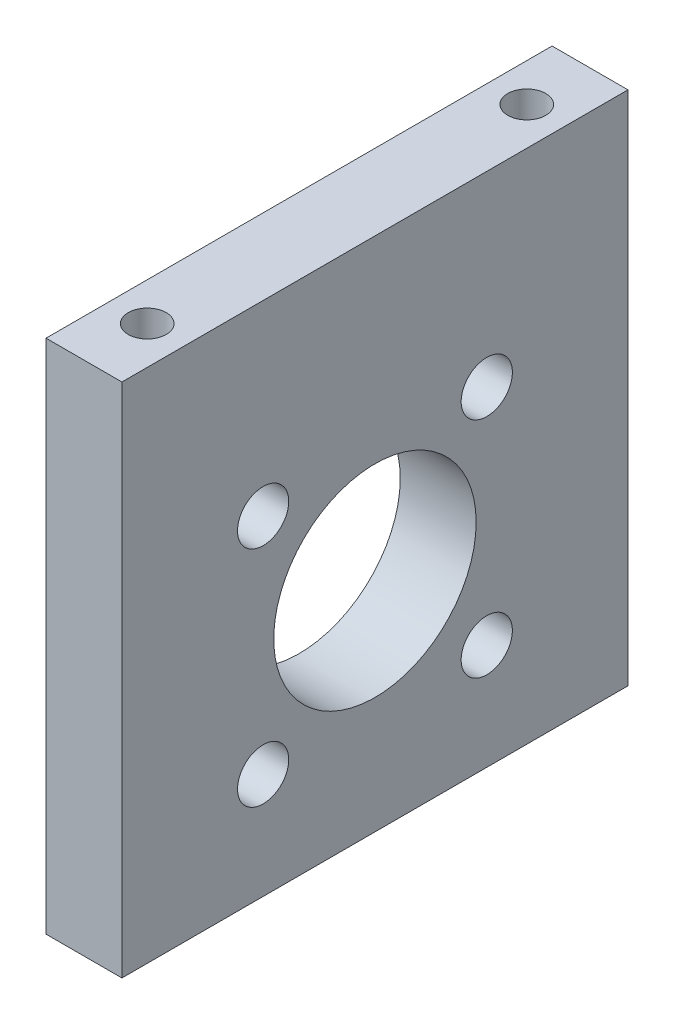
ISO-10303-21;
HEADER;
FILE_DESCRIPTION(('STEP AP214'),'2;1');
FILE_NAME('part.step','',(''),(''),'','','');
FILE_SCHEMA(('AUTOMOTIVE_DESIGN { 1 0 10303 214 1 1 1 1 }'));
ENDSEC;
DATA;
#1=APPLICATION_CONTEXT('core data for automotive mechanical design processes');
#2=APPLICATION_PROTOCOL_DEFINITION('international standard','automotive_design',2000,#1);
#3=PRODUCT_CONTEXT('',#1,'mechanical');
#4=PRODUCT('Part','Part','',(#3));
#5=PRODUCT_RELATED_PRODUCT_CATEGORY('part','',(#4));
#6=PRODUCT_DEFINITION_FORMATION('','',#4);
#7=PRODUCT_DEFINITION_CONTEXT('part definition',#1,'design');
#8=PRODUCT_DEFINITION('design','',#6,#7);
#9=PRODUCT_DEFINITION_SHAPE('','',#8);
#10=(LENGTH_UNIT() NAMED_UNIT(*) SI_UNIT(.MILLI.,.METRE.));
#11=(NAMED_UNIT(*) PLANE_ANGLE_UNIT() SI_UNIT($,.RADIAN.));
#12=(NAMED_UNIT(*) SI_UNIT($,.STERADIAN.) SOLID_ANGLE_UNIT());
#13=UNCERTAINTY_MEASURE_WITH_UNIT(LENGTH_MEASURE(1.E-05),#10,'distance_accuracy_value','');
#14=(GEOMETRIC_REPRESENTATION_CONTEXT(3) GLOBAL_UNCERTAINTY_ASSIGNED_CONTEXT((#13)) GLOBAL_UNIT_ASSIGNED_CONTEXT((#10,
#11,#12)) REPRESENTATION_CONTEXT('',''));
#15=CARTESIAN_POINT('',(0.,0.,0.));
#16=DIRECTION('',(0.,0.,1.));
#17=DIRECTION('',(1.,0.,0.));
#18=AXIS2_PLACEMENT_3D('',#15,#16,#17);
#19=CARTESIAN_POINT('',(6.,0.,0.));
#20=DIRECTION('',(1.,0.,0.));
#21=DIRECTION('',(0.,0.,-1.));
#22=AXIS2_PLACEMENT_3D('',#19,#20,#21);
#23=PLANE('',#22);
#24=CARTESIAN_POINT('',(6.,-8.83883476483182,-8.83883476483186));
#25=DIRECTION('',(1.,0.,0.));
#26=DIRECTION('',(0.,0.,-1.));
#27=AXIS2_PLACEMENT_3D('',#24,#25,#26);
#28=CIRCLE('',#27,2.025);
#29=CARTESIAN_POINT('',(6.,-8.83883476483182,-10.8638347648319));
#30=VERTEX_POINT('',#29);
#31=EDGE_CURVE('E134',#30,#30,#28,.T.);
#32=ORIENTED_EDGE('',*,*,#31,.F.);
#33=EDGE_LOOP('',(#32));
#34=FACE_BOUND('',#33,.T.);
#35=CARTESIAN_POINT('',(6.,8.83883476483183,8.83883476483186));
#36=DIRECTION('',(1.,0.,0.));
#37=DIRECTION('',(0.,0.,-1.));
#38=AXIS2_PLACEMENT_3D('',#35,#36,#37);
#39=CIRCLE('',#38,2.025);
#40=CARTESIAN_POINT('',(6.,8.83883476483183,6.81383476483186));
#41=VERTEX_POINT('',#40);
#42=EDGE_CURVE('E121',#41,#41,#39,.T.);
#43=ORIENTED_EDGE('',*,*,#42,.F.);
#44=EDGE_LOOP('',(#43));
#45=FACE_BOUND('',#44,.T.);
#46=DIRECTION('',(0.,-1.,0.));
#47=VECTOR('',#46,1.);
#48=CARTESIAN_POINT('',(6.,23.6,20.));
#49=LINE('',#48,#47);
#50=CARTESIAN_POINT('',(6.,23.6,20.));
#51=VERTEX_POINT('',#50);
#52=CARTESIAN_POINT('',(6.,-17.2,20.));
#53=VERTEX_POINT('',#52);
#54=EDGE_CURVE('E93',#51,#53,#49,.T.);
#55=ORIENTED_EDGE('',*,*,#54,.T.);
#56=DIRECTION('',(0.,0.,-1.));
#57=VECTOR('',#56,1.);
#58=CARTESIAN_POINT('',(6.,-17.2,20.));
#59=LINE('',#58,#57);
#60=CARTESIAN_POINT('',(6.,-17.2,-20.));
#61=VERTEX_POINT('',#60);
#62=EDGE_CURVE('E88',#53,#61,#59,.T.);
#63=ORIENTED_EDGE('',*,*,#62,.T.);
#64=DIRECTION('',(0.,1.,0.));
#65=VECTOR('',#64,1.);
#66=CARTESIAN_POINT('',(6.,23.6,-20.));
#67=LINE('',#66,#65);
#68=CARTESIAN_POINT('',(6.,23.6,-20.));
#69=VERTEX_POINT('',#68);
#70=EDGE_CURVE('E91',#61,#69,#67,.T.);
#71=ORIENTED_EDGE('',*,*,#70,.T.);
#72=DIRECTION('',(0.,0.,1.));
#73=VECTOR('',#72,1.);
#74=CARTESIAN_POINT('',(6.,23.6,20.));
#75=LINE('',#74,#73);
#76=EDGE_CURVE('E59',#69,#51,#75,.T.);
#77=ORIENTED_EDGE('',*,*,#76,.T.);
#78=EDGE_LOOP('',(#55,#63,#71,#77));
#79=FACE_BOUND('',#78,.T.);
#80=CARTESIAN_POINT('',(6.,0.,0.));
#81=DIRECTION('',(1.,0.,0.));
#82=DIRECTION('',(0.,0.,-1.));
#83=AXIS2_PLACEMENT_3D('',#80,#81,#82);
#84=CIRCLE('',#83,8.);
#85=CARTESIAN_POINT('',(6.,0.,-8.));
#86=VERTEX_POINT('',#85);
#87=EDGE_CURVE('E108',#86,#86,#84,.T.);
#88=ORIENTED_EDGE('',*,*,#87,.F.);
#89=EDGE_LOOP('',(#88));
#90=FACE_BOUND('',#89,.T.);
#91=CARTESIAN_POINT('',(6.,8.83883476483186,-8.83883476483183));
#92=DIRECTION('',(1.,0.,0.));
#93=DIRECTION('',(0.,0.,-1.));
#94=AXIS2_PLACEMENT_3D('',#91,#92,#93);
#95=CIRCLE('',#94,2.025);
#96=CARTESIAN_POINT('',(6.,8.83883476483186,-10.8638347648318));
#97=VERTEX_POINT('',#96);
#98=EDGE_CURVE('E129',#97,#97,#95,.T.);
#99=ORIENTED_EDGE('',*,*,#98,.F.);
#100=EDGE_LOOP('',(#99));
#101=FACE_BOUND('',#100,.T.);
#102=CARTESIAN_POINT('',(6.,-8.83883476483186,8.83883476483182));
#103=DIRECTION('',(1.,0.,0.));
#104=DIRECTION('',(0.,0.,-1.));
#105=AXIS2_PLACEMENT_3D('',#102,#103,#104);
#106=CIRCLE('',#105,2.025);
#107=CARTESIAN_POINT('',(6.,-8.83883476483186,6.81383476483182));
#108=VERTEX_POINT('',#107);
#109=EDGE_CURVE('E141',#108,#108,#106,.T.);
#110=ORIENTED_EDGE('',*,*,#109,.F.);
#111=EDGE_LOOP('',(#110));
#112=FACE_BOUND('',#111,.T.);
#113=ADVANCED_FACE('F41',(#34,#45,#79,#90,#101,#112),#23,.T.);
#114=CARTESIAN_POINT('',(0.,0.,0.));
#115=DIRECTION('',(1.,0.,0.));
#116=DIRECTION('',(0.,0.,-1.));
#117=AXIS2_PLACEMENT_3D('',#114,#115,#116);
#118=PLANE('',#117);
#119=DIRECTION('',(0.,-1.,0.));
#120=VECTOR('',#119,1.);
#121=CARTESIAN_POINT('',(0.,23.6,20.));
#122=LINE('',#121,#120);
#123=CARTESIAN_POINT('',(0.,23.6,20.));
#124=VERTEX_POINT('',#123);
#125=CARTESIAN_POINT('',(0.,-17.2,20.));
#126=VERTEX_POINT('',#125);
#127=EDGE_CURVE('E103',#124,#126,#122,.T.);
#128=ORIENTED_EDGE('',*,*,#127,.F.);
#129=DIRECTION('',(0.,0.,1.));
#130=VECTOR('',#129,1.);
#131=CARTESIAN_POINT('',(0.,23.6,20.));
#132=LINE('',#131,#130);
#133=CARTESIAN_POINT('',(0.,23.6,-20.));
#134=VERTEX_POINT('',#133);
#135=EDGE_CURVE('E83',#134,#124,#132,.T.);
#136=ORIENTED_EDGE('',*,*,#135,.F.);
#137=DIRECTION('',(0.,1.,0.));
#138=VECTOR('',#137,1.);
#139=CARTESIAN_POINT('',(0.,23.6,-20.));
#140=LINE('',#139,#138);
#141=CARTESIAN_POINT('',(0.,-17.2,-20.));
#142=VERTEX_POINT('',#141);
#143=EDGE_CURVE('E71',#142,#134,#140,.T.);
#144=ORIENTED_EDGE('',*,*,#143,.F.);
#145=DIRECTION('',(0.,0.,-1.));
#146=VECTOR('',#145,1.);
#147=CARTESIAN_POINT('',(0.,-17.2,20.));
#148=LINE('',#147,#146);
#149=EDGE_CURVE('E100',#126,#142,#148,.T.);
#150=ORIENTED_EDGE('',*,*,#149,.F.);
#151=EDGE_LOOP('',(#128,#136,#144,#150));
#152=FACE_BOUND('',#151,.T.);
#153=CARTESIAN_POINT('',(0.,0.,0.));
#154=DIRECTION('',(1.,0.,0.));
#155=DIRECTION('',(0.,0.,-1.));
#156=AXIS2_PLACEMENT_3D('',#153,#154,#155);
#157=CIRCLE('',#156,8.);
#158=CARTESIAN_POINT('',(0.,0.,-8.));
#159=VERTEX_POINT('',#158);
#160=EDGE_CURVE('E116',#159,#159,#157,.T.);
#161=ORIENTED_EDGE('',*,*,#160,.T.);
#162=EDGE_LOOP('',(#161));
#163=FACE_BOUND('',#162,.T.);
#164=CARTESIAN_POINT('',(0.,8.83883476483183,8.83883476483186));
#165=DIRECTION('',(1.,0.,0.));
#166=DIRECTION('',(0.,0.,-1.));
#167=AXIS2_PLACEMENT_3D('',#164,#165,#166);
#168=CIRCLE('',#167,2.025);
#169=CARTESIAN_POINT('',(0.,8.83883476483183,6.81383476483186));
#170=VERTEX_POINT('',#169);
#171=EDGE_CURVE('E128',#170,#170,#168,.T.);
#172=ORIENTED_EDGE('',*,*,#171,.T.);
#173=EDGE_LOOP('',(#172));
#174=FACE_BOUND('',#173,.T.);
#175=CARTESIAN_POINT('',(0.,8.83883476483186,-8.83883476483183));
#176=DIRECTION('',(1.,0.,0.));
#177=DIRECTION('',(0.,0.,-1.));
#178=AXIS2_PLACEMENT_3D('',#175,#176,#177);
#179=CIRCLE('',#178,2.025);
#180=CARTESIAN_POINT('',(0.,8.83883476483186,-10.8638347648318));
#181=VERTEX_POINT('',#180);
#182=EDGE_CURVE('E135',#181,#181,#179,.T.);
#183=ORIENTED_EDGE('',*,*,#182,.T.);
#184=EDGE_LOOP('',(#183));
#185=FACE_BOUND('',#184,.T.);
#186=CARTESIAN_POINT('',(0.,-8.83883476483182,-8.83883476483186));
#187=DIRECTION('',(1.,0.,0.));
#188=DIRECTION('',(0.,0.,-1.));
#189=AXIS2_PLACEMENT_3D('',#186,#187,#188);
#190=CIRCLE('',#189,2.025);
#191=CARTESIAN_POINT('',(0.,-8.83883476483182,-10.8638347648319));
#192=VERTEX_POINT('',#191);
#193=EDGE_CURVE('E138',#192,#192,#190,.T.);
#194=ORIENTED_EDGE('',*,*,#193,.T.);
#195=EDGE_LOOP('',(#194));
#196=FACE_BOUND('',#195,.T.);
#197=CARTESIAN_POINT('',(0.,-8.83883476483186,8.83883476483182));
#198=DIRECTION('',(1.,0.,0.));
#199=DIRECTION('',(0.,0.,-1.));
#200=AXIS2_PLACEMENT_3D('',#197,#198,#199);
#201=CIRCLE('',#200,2.025);
#202=CARTESIAN_POINT('',(0.,-8.83883476483186,6.81383476483182));
#203=VERTEX_POINT('',#202);
#204=EDGE_CURVE('E143',#203,#203,#201,.T.);
#205=ORIENTED_EDGE('',*,*,#204,.T.);
#206=EDGE_LOOP('',(#205));
#207=FACE_BOUND('',#206,.T.);
#208=ADVANCED_FACE('F117',(#152,#163,#174,#185,#196,#207),#118,.F.);
#209=CARTESIAN_POINT('',(6.,23.6,20.));
#210=DIRECTION('',(0.,0.,-1.));
#211=DIRECTION('',(0.,1.,0.));
#212=AXIS2_PLACEMENT_3D('',#209,#210,#211);
#213=PLANE('',#212);
#214=ORIENTED_EDGE('',*,*,#127,.T.);
#215=DIRECTION('',(-1.,0.,0.));
#216=VECTOR('',#215,1.);
#217=CARTESIAN_POINT('',(6.,-17.2,20.));
#218=LINE('',#217,#216);
#219=EDGE_CURVE('E11',#53,#126,#218,.T.);
#220=ORIENTED_EDGE('',*,*,#219,.F.);
#221=ORIENTED_EDGE('',*,*,#54,.F.);
#222=DIRECTION('',(-1.,0.,0.));
#223=VECTOR('',#222,1.);
#224=CARTESIAN_POINT('',(6.,23.6,20.));
#225=LINE('',#224,#223);
#226=EDGE_CURVE('E102',#51,#124,#225,.T.);
#227=ORIENTED_EDGE('',*,*,#226,.T.);
#228=EDGE_LOOP('',(#214,#220,#221,#227));
#229=FACE_BOUND('',#228,.T.);
#230=ADVANCED_FACE('F43',(#229),#213,.F.);
#231=CARTESIAN_POINT('',(6.,-17.2,20.));
#232=DIRECTION('',(0.,1.,0.));
#233=DIRECTION('',(0.,0.,1.));
#234=AXIS2_PLACEMENT_3D('',#231,#232,#233);
#235=PLANE('',#234);
#236=CARTESIAN_POINT('',(3.,-17.2,-15.));
#237=DIRECTION('',(0.,1.,0.));
#238=DIRECTION('',(0.,0.,1.));
#239=AXIS2_PLACEMENT_3D('',#236,#237,#238);
#240=CIRCLE('',#239,1.5);
#241=CARTESIAN_POINT('',(3.,-17.2,-13.5));
#242=VERTEX_POINT('',#241);
#243=EDGE_CURVE('E150',#242,#242,#240,.T.);
#244=ORIENTED_EDGE('',*,*,#243,.T.);
#245=EDGE_LOOP('',(#244));
#246=FACE_BOUND('',#245,.T.);
#247=CARTESIAN_POINT('',(3.,-17.2,15.));
#248=DIRECTION('',(0.,1.,0.));
#249=DIRECTION('',(0.,0.,-1.));
#250=AXIS2_PLACEMENT_3D('',#247,#248,#249);
#251=CIRCLE('',#250,1.5);
#252=CARTESIAN_POINT('',(3.,-17.2,16.5));
#253=VERTEX_POINT('',#252);
#254=EDGE_CURVE('E154',#253,#253,#251,.T.);
#255=ORIENTED_EDGE('',*,*,#254,.T.);
#256=EDGE_LOOP('',(#255));
#257=FACE_BOUND('',#256,.T.);
#258=ORIENTED_EDGE('',*,*,#149,.T.);
#259=DIRECTION('',(-1.,0.,0.));
#260=VECTOR('',#259,1.);
#261=CARTESIAN_POINT('',(6.,-17.2,-20.));
#262=LINE('',#261,#260);
#263=EDGE_CURVE('E49',#61,#142,#262,.T.);
#264=ORIENTED_EDGE('',*,*,#263,.F.);
#265=ORIENTED_EDGE('',*,*,#62,.F.);
#266=ORIENTED_EDGE('',*,*,#219,.T.);
#267=EDGE_LOOP('',(#258,#264,#265,#266));
#268=FACE_BOUND('',#267,.T.);
#269=ADVANCED_FACE('F96',(#246,#257,#268),#235,.F.);
#270=CARTESIAN_POINT('',(6.,23.6,-20.));
#271=DIRECTION('',(0.,0.,1.));
#272=DIRECTION('',(0.,-1.,0.));
#273=AXIS2_PLACEMENT_3D('',#270,#271,#272);
#274=PLANE('',#273);
#275=ORIENTED_EDGE('',*,*,#143,.T.);
#276=DIRECTION('',(-1.,0.,0.));
#277=VECTOR('',#276,1.);
#278=CARTESIAN_POINT('',(6.,23.6,-20.));
#279=LINE('',#278,#277);
#280=EDGE_CURVE('E97',#69,#134,#279,.T.);
#281=ORIENTED_EDGE('',*,*,#280,.F.);
#282=ORIENTED_EDGE('',*,*,#70,.F.);
#283=ORIENTED_EDGE('',*,*,#263,.T.);
#284=EDGE_LOOP('',(#275,#281,#282,#283));
#285=FACE_BOUND('',#284,.T.);
#286=ADVANCED_FACE('F98',(#285),#274,.F.);
#287=CARTESIAN_POINT('',(6.,23.6,20.));
#288=DIRECTION('',(0.,-1.,0.));
#289=DIRECTION('',(0.,0.,-1.));
#290=AXIS2_PLACEMENT_3D('',#287,#288,#289);
#291=PLANE('',#290);
#292=CARTESIAN_POINT('',(3.,23.6,-15.));
#293=DIRECTION('',(0.,1.,0.));
#294=DIRECTION('',(0.,0.,1.));
#295=AXIS2_PLACEMENT_3D('',#292,#293,#294);
#296=CIRCLE('',#295,1.5);
#297=CARTESIAN_POINT('',(3.,23.6,-13.5));
#298=VERTEX_POINT('',#297);
#299=EDGE_CURVE('E153',#298,#298,#296,.T.);
#300=ORIENTED_EDGE('',*,*,#299,.F.);
#301=EDGE_LOOP('',(#300));
#302=FACE_BOUND('',#301,.T.);
#303=CARTESIAN_POINT('',(3.,23.6,15.));
#304=DIRECTION('',(0.,1.,0.));
#305=DIRECTION('',(0.,0.,-1.));
#306=AXIS2_PLACEMENT_3D('',#303,#304,#305);
#307=CIRCLE('',#306,1.5);
#308=CARTESIAN_POINT('',(3.,23.6,16.5));
#309=VERTEX_POINT('',#308);
#310=EDGE_CURVE('E148',#309,#309,#307,.T.);
#311=ORIENTED_EDGE('',*,*,#310,.F.);
#312=EDGE_LOOP('',(#311));
#313=FACE_BOUND('',#312,.T.);
#314=ORIENTED_EDGE('',*,*,#135,.T.);
#315=ORIENTED_EDGE('',*,*,#226,.F.);
#316=ORIENTED_EDGE('',*,*,#76,.F.);
#317=ORIENTED_EDGE('',*,*,#280,.T.);
#318=EDGE_LOOP('',(#314,#315,#316,#317));
#319=FACE_BOUND('',#318,.T.);
#320=ADVANCED_FACE('F111',(#302,#313,#319),#291,.F.);
#321=CARTESIAN_POINT('',(6.,0.,0.));
#322=DIRECTION('',(-1.,0.,0.));
#323=DIRECTION('',(0.,0.,1.));
#324=AXIS2_PLACEMENT_3D('',#321,#322,#323);
#325=CYLINDRICAL_SURFACE('',#324,8.);
#326=ORIENTED_EDGE('',*,*,#87,.T.);
#327=EDGE_LOOP('',(#326));
#328=FACE_BOUND('',#327,.T.);
#329=ORIENTED_EDGE('',*,*,#160,.F.);
#330=EDGE_LOOP('',(#329));
#331=FACE_BOUND('',#330,.T.);
#332=ADVANCED_FACE('F168',(#328,#331),#325,.F.);
#333=CARTESIAN_POINT('',(6.,8.83883476483183,8.83883476483186));
#334=DIRECTION('',(-1.,0.,0.));
#335=DIRECTION('',(0.,0.,1.));
#336=AXIS2_PLACEMENT_3D('',#333,#334,#335);
#337=CYLINDRICAL_SURFACE('',#336,2.025);
#338=ORIENTED_EDGE('',*,*,#42,.T.);
#339=EDGE_LOOP('',(#338));
#340=FACE_BOUND('',#339,.T.);
#341=ORIENTED_EDGE('',*,*,#171,.F.);
#342=EDGE_LOOP('',(#341));
#343=FACE_BOUND('',#342,.T.);
#344=ADVANCED_FACE('F225',(#340,#343),#337,.F.);
#345=CARTESIAN_POINT('',(6.,8.83883476483186,-8.83883476483183));
#346=DIRECTION('',(-1.,0.,0.));
#347=DIRECTION('',(0.,0.,1.));
#348=AXIS2_PLACEMENT_3D('',#345,#346,#347);
#349=CYLINDRICAL_SURFACE('',#348,2.025);
#350=ORIENTED_EDGE('',*,*,#98,.T.);
#351=EDGE_LOOP('',(#350));
#352=FACE_BOUND('',#351,.T.);
#353=ORIENTED_EDGE('',*,*,#182,.F.);
#354=EDGE_LOOP('',(#353));
#355=FACE_BOUND('',#354,.T.);
#356=ADVANCED_FACE('F229',(#352,#355),#349,.F.);
#357=CARTESIAN_POINT('',(6.,-8.83883476483182,-8.83883476483186));
#358=DIRECTION('',(-1.,0.,0.));
#359=DIRECTION('',(0.,0.,1.));
#360=AXIS2_PLACEMENT_3D('',#357,#358,#359);
#361=CYLINDRICAL_SURFACE('',#360,2.025);
#362=ORIENTED_EDGE('',*,*,#31,.T.);
#363=EDGE_LOOP('',(#362));
#364=FACE_BOUND('',#363,.T.);
#365=ORIENTED_EDGE('',*,*,#193,.F.);
#366=EDGE_LOOP('',(#365));
#367=FACE_BOUND('',#366,.T.);
#368=ADVANCED_FACE('F181',(#364,#367),#361,.F.);
#369=CARTESIAN_POINT('',(6.,-8.83883476483186,8.83883476483182));
#370=DIRECTION('',(-1.,0.,0.));
#371=DIRECTION('',(0.,0.,1.));
#372=AXIS2_PLACEMENT_3D('',#369,#370,#371);
#373=CYLINDRICAL_SURFACE('',#372,2.025);
#374=ORIENTED_EDGE('',*,*,#109,.T.);
#375=EDGE_LOOP('',(#374));
#376=FACE_BOUND('',#375,.T.);
#377=ORIENTED_EDGE('',*,*,#204,.F.);
#378=EDGE_LOOP('',(#377));
#379=FACE_BOUND('',#378,.T.);
#380=ADVANCED_FACE('F175',(#376,#379),#373,.F.);
#381=CARTESIAN_POINT('',(3.,-17.2,15.));
#382=DIRECTION('',(0.,1.,0.));
#383=DIRECTION('',(0.,0.,1.));
#384=AXIS2_PLACEMENT_3D('',#381,#382,#383);
#385=CYLINDRICAL_SURFACE('',#384,1.5);
#386=CARTESIAN_POINT('',(3.,-17.2,16.5));
#387=CARTESIAN_POINT('',(3.,-16.775,16.5));
#388=CARTESIAN_POINT('',(3.,-16.35,16.5));
#389=CARTESIAN_POINT('',(3.,-15.5,16.5));
#390=CARTESIAN_POINT('',(3.,-15.075,16.5));
#391=CARTESIAN_POINT('',(3.,-14.225,16.5));
#392=CARTESIAN_POINT('',(3.,-13.8,16.5));
#393=CARTESIAN_POINT('',(3.,-12.95,16.5));
#394=CARTESIAN_POINT('',(3.,-12.525,16.5));
#395=CARTESIAN_POINT('',(3.,-11.675,16.5));
#396=CARTESIAN_POINT('',(3.,-11.25,16.5));
#397=CARTESIAN_POINT('',(3.,-10.4,16.5));
#398=CARTESIAN_POINT('',(3.,-9.975,16.5));
#399=CARTESIAN_POINT('',(3.,-9.125,16.5));
#400=CARTESIAN_POINT('',(3.,-8.7,16.5));
#401=CARTESIAN_POINT('',(3.,-7.85,16.5));
#402=CARTESIAN_POINT('',(3.,-7.425,16.5));
#403=CARTESIAN_POINT('',(3.,-6.575,16.5));
#404=CARTESIAN_POINT('',(3.,-6.15,16.5));
#405=CARTESIAN_POINT('',(3.,-5.3,16.5));
#406=CARTESIAN_POINT('',(3.,-4.875,16.5));
#407=CARTESIAN_POINT('',(3.,-4.025,16.5));
#408=CARTESIAN_POINT('',(3.,-3.6,16.5));
#409=CARTESIAN_POINT('',(3.,-2.75,16.5));
#410=CARTESIAN_POINT('',(3.,-2.325,16.5));
#411=CARTESIAN_POINT('',(3.,-1.475,16.5));
#412=CARTESIAN_POINT('',(3.,-1.05,16.5));
#413=CARTESIAN_POINT('',(3.,-0.200000000000003,16.5));
#414=CARTESIAN_POINT('',(3.,0.224999999999997,16.5));
#415=CARTESIAN_POINT('',(3.,1.075,16.5));
#416=CARTESIAN_POINT('',(3.,1.5,16.5));
#417=CARTESIAN_POINT('',(3.,2.35,16.5));
#418=CARTESIAN_POINT('',(3.,2.775,16.5));
#419=CARTESIAN_POINT('',(3.,3.625,16.5));
#420=CARTESIAN_POINT('',(3.,4.05,16.5));
#421=CARTESIAN_POINT('',(3.,4.9,16.5));
#422=CARTESIAN_POINT('',(3.,5.325,16.5));
#423=CARTESIAN_POINT('',(3.,6.175,16.5));
#424=CARTESIAN_POINT('',(3.,6.6,16.5));
#425=CARTESIAN_POINT('',(3.,7.45,16.5));
#426=CARTESIAN_POINT('',(3.,7.875,16.5));
#427=CARTESIAN_POINT('',(3.,8.725,16.5));
#428=CARTESIAN_POINT('',(3.,9.15,16.5));
#429=CARTESIAN_POINT('',(3.,10.,16.5));
#430=CARTESIAN_POINT('',(3.,10.425,16.5));
#431=CARTESIAN_POINT('',(3.,11.275,16.5));
#432=CARTESIAN_POINT('',(3.,11.7,16.5));
#433=CARTESIAN_POINT('',(3.,12.55,16.5));
#434=CARTESIAN_POINT('',(3.,12.975,16.5));
#435=CARTESIAN_POINT('',(3.,13.825,16.5));
#436=CARTESIAN_POINT('',(3.,14.25,16.5));
#437=CARTESIAN_POINT('',(3.,15.1,16.5));
#438=CARTESIAN_POINT('',(3.,15.525,16.5));
#439=CARTESIAN_POINT('',(3.,16.375,16.5));
#440=CARTESIAN_POINT('',(3.,16.8,16.5));
#441=CARTESIAN_POINT('',(3.,17.65,16.5));
#442=CARTESIAN_POINT('',(3.,18.075,16.5));
#443=CARTESIAN_POINT('',(3.,18.925,16.5));
#444=CARTESIAN_POINT('',(3.,19.35,16.5));
#445=CARTESIAN_POINT('',(3.,20.2,16.5));
#446=CARTESIAN_POINT('',(3.,20.625,16.5));
#447=CARTESIAN_POINT('',(3.,21.475,16.5));
#448=CARTESIAN_POINT('',(3.,21.9,16.5));
#449=CARTESIAN_POINT('',(3.,22.75,16.5));
#450=CARTESIAN_POINT('',(3.,23.175,16.5));
#451=CARTESIAN_POINT('',(3.,23.6,16.5));
#452=B_SPLINE_CURVE_WITH_KNOTS('',3,(#386,#387,#388,#389,#390,#391,#392,#393,#394,#395,#396,
#397,#398,#399,#400,#401,#402,#403,#404,#405,#406,#407,#408,#409,#410,#411,#412,#413,#414,#415,
#416,#417,#418,#419,#420,#421,#422,#423,#424,#425,#426,#427,#428,#429,#430,#431,#432,#433,#434,
#435,#436,#437,#438,#439,#440,#441,#442,#443,#444,#445,#446,#447,#448,#449,#450,#451),
.UNSPECIFIED.,.F.,.F.,(4,2,2,2,2,2,2,2,2,2,2,2,2,2,2,2,2,2,2,2,2,2,2,2,2,2,2,2,2,2,2,2,4),(0.,
1.275,2.55,3.825,5.1,6.375,7.65,8.925,10.2,11.475,12.75,14.025,15.3,16.575,17.85,19.125,20.4,
21.675,22.95,24.225,25.5,26.775,28.05,29.325,30.6,31.875,33.15,34.425,35.7,36.975,38.25,39.525,
40.8),.UNSPECIFIED.);
#453=EDGE_CURVE('BSEAM169',#253,#309,#452,.T.);
#454=ORIENTED_EDGE('',*,*,#254,.F.);
#455=ORIENTED_EDGE('',*,*,#310,.T.);
#456=ORIENTED_EDGE('',*,*,#453,.T.);
#457=ORIENTED_EDGE('',*,*,#453,.F.);
#458=EDGE_LOOP('',(#454,#456,#455,#457));
#459=FACE_BOUND('',#458,.T.);
#460=ADVANCED_FACE('F169',(#459),#385,.F.);
#461=CARTESIAN_POINT('',(3.,-17.2,-15.));
#462=DIRECTION('',(0.,1.,0.));
#463=DIRECTION('',(0.,0.,1.));
#464=AXIS2_PLACEMENT_3D('',#461,#462,#463);
#465=CYLINDRICAL_SURFACE('',#464,1.5);
#466=CARTESIAN_POINT('',(3.,-17.2,-13.5));
#467=CARTESIAN_POINT('',(3.,-16.775,-13.5));
#468=CARTESIAN_POINT('',(3.,-16.35,-13.5));
#469=CARTESIAN_POINT('',(3.,-15.5,-13.5));
#470=CARTESIAN_POINT('',(3.,-15.075,-13.5));
#471=CARTESIAN_POINT('',(3.,-14.225,-13.5));
#472=CARTESIAN_POINT('',(3.,-13.8,-13.5));
#473=CARTESIAN_POINT('',(3.,-12.95,-13.5));
#474=CARTESIAN_POINT('',(3.,-12.525,-13.5));
#475=CARTESIAN_POINT('',(3.,-11.675,-13.5));
#476=CARTESIAN_POINT('',(3.,-11.25,-13.5));
#477=CARTESIAN_POINT('',(3.,-10.4,-13.5));
#478=CARTESIAN_POINT('',(3.,-9.975,-13.5));
#479=CARTESIAN_POINT('',(3.,-9.125,-13.5));
#480=CARTESIAN_POINT('',(3.,-8.7,-13.5));
#481=CARTESIAN_POINT('',(3.,-7.85,-13.5));
#482=CARTESIAN_POINT('',(3.,-7.425,-13.5));
#483=CARTESIAN_POINT('',(3.,-6.575,-13.5));
#484=CARTESIAN_POINT('',(3.,-6.15,-13.5));
#485=CARTESIAN_POINT('',(3.,-5.3,-13.5));
#486=CARTESIAN_POINT('',(3.,-4.875,-13.5));
#487=CARTESIAN_POINT('',(3.,-4.025,-13.5));
#488=CARTESIAN_POINT('',(3.,-3.6,-13.5));
#489=CARTESIAN_POINT('',(3.,-2.75,-13.5));
#490=CARTESIAN_POINT('',(3.,-2.325,-13.5));
#491=CARTESIAN_POINT('',(3.,-1.475,-13.5));
#492=CARTESIAN_POINT('',(3.,-1.05,-13.5));
#493=CARTESIAN_POINT('',(3.,-0.200000000000003,-13.5));
#494=CARTESIAN_POINT('',(3.,0.224999999999997,-13.5));
#495=CARTESIAN_POINT('',(3.,1.075,-13.5));
#496=CARTESIAN_POINT('',(3.,1.5,-13.5));
#497=CARTESIAN_POINT('',(3.,2.35,-13.5));
#498=CARTESIAN_POINT('',(3.,2.775,-13.5));
#499=CARTESIAN_POINT('',(3.,3.625,-13.5));
#500=CARTESIAN_POINT('',(3.,4.05,-13.5));
#501=CARTESIAN_POINT('',(3.,4.9,-13.5));
#502=CARTESIAN_POINT('',(3.,5.325,-13.5));
#503=CARTESIAN_POINT('',(3.,6.175,-13.5));
#504=CARTESIAN_POINT('',(3.,6.6,-13.5));
#505=CARTESIAN_POINT('',(3.,7.45,-13.5));
#506=CARTESIAN_POINT('',(3.,7.875,-13.5));
#507=CARTESIAN_POINT('',(3.,8.725,-13.5));
#508=CARTESIAN_POINT('',(3.,9.15,-13.5));
#509=CARTESIAN_POINT('',(3.,10.,-13.5));
#510=CARTESIAN_POINT('',(3.,10.425,-13.5));
#511=CARTESIAN_POINT('',(3.,11.275,-13.5));
#512=CARTESIAN_POINT('',(3.,11.7,-13.5));
#513=CARTESIAN_POINT('',(3.,12.55,-13.5));
#514=CARTESIAN_POINT('',(3.,12.975,-13.5));
#515=CARTESIAN_POINT('',(3.,13.825,-13.5));
#516=CARTESIAN_POINT('',(3.,14.25,-13.5));
#517=CARTESIAN_POINT('',(3.,15.1,-13.5));
#518=CARTESIAN_POINT('',(3.,15.525,-13.5));
#519=CARTESIAN_POINT('',(3.,16.375,-13.5));
#520=CARTESIAN_POINT('',(3.,16.8,-13.5));
#521=CARTESIAN_POINT('',(3.,17.65,-13.5));
#522=CARTESIAN_POINT('',(3.,18.075,-13.5));
#523=CARTESIAN_POINT('',(3.,18.925,-13.5));
#524=CARTESIAN_POINT('',(3.,19.35,-13.5));
#525=CARTESIAN_POINT('',(3.,20.2,-13.5));
#526=CARTESIAN_POINT('',(3.,20.625,-13.5));
#527=CARTESIAN_POINT('',(3.,21.475,-13.5));
#528=CARTESIAN_POINT('',(3.,21.9,-13.5));
#529=CARTESIAN_POINT('',(3.,22.75,-13.5));
#530=CARTESIAN_POINT('',(3.,23.175,-13.5));
#531=CARTESIAN_POINT('',(3.,23.6,-13.5));
#532=B_SPLINE_CURVE_WITH_KNOTS('',3,(#466,#467,#468,#469,#470,#471,#472,#473,#474,#475,#476,
#477,#478,#479,#480,#481,#482,#483,#484,#485,#486,#487,#488,#489,#490,#491,#492,#493,#494,#495,
#496,#497,#498,#499,#500,#501,#502,#503,#504,#505,#506,#507,#508,#509,#510,#511,#512,#513,#514,
#515,#516,#517,#518,#519,#520,#521,#522,#523,#524,#525,#526,#527,#528,#529,#530,#531),
.UNSPECIFIED.,.F.,.F.,(4,2,2,2,2,2,2,2,2,2,2,2,2,2,2,2,2,2,2,2,2,2,2,2,2,2,2,2,2,2,2,2,4),(0.,
1.275,2.55,3.825,5.1,6.375,7.65,8.925,10.2,11.475,12.75,14.025,15.3,16.575,17.85,19.125,20.4,
21.675,22.95,24.225,25.5,26.775,28.05,29.325,30.6,31.875,33.15,34.425,35.7,36.975,38.25,39.525,
40.8),.UNSPECIFIED.);
#533=EDGE_CURVE('BSEAM165',#242,#298,#532,.T.);
#534=ORIENTED_EDGE('',*,*,#243,.F.);
#535=ORIENTED_EDGE('',*,*,#299,.T.);
#536=ORIENTED_EDGE('',*,*,#533,.T.);
#537=ORIENTED_EDGE('',*,*,#533,.F.);
#538=EDGE_LOOP('',(#534,#536,#535,#537));
#539=FACE_BOUND('',#538,.T.);
#540=ADVANCED_FACE('F165',(#539),#465,.F.);
#541=CLOSED_SHELL('',(#113,#208,#230,#269,#286,#320,#332,#344,#356,#368,#380,#460,#540));
#542=MANIFOLD_SOLID_BREP('B2',#541);
#543=ADVANCED_BREP_SHAPE_REPRESENTATION('',(#18,#542),#14);
#544=SHAPE_DEFINITION_REPRESENTATION(#9,#543);
ENDSEC;
END-ISO-10303-21;
